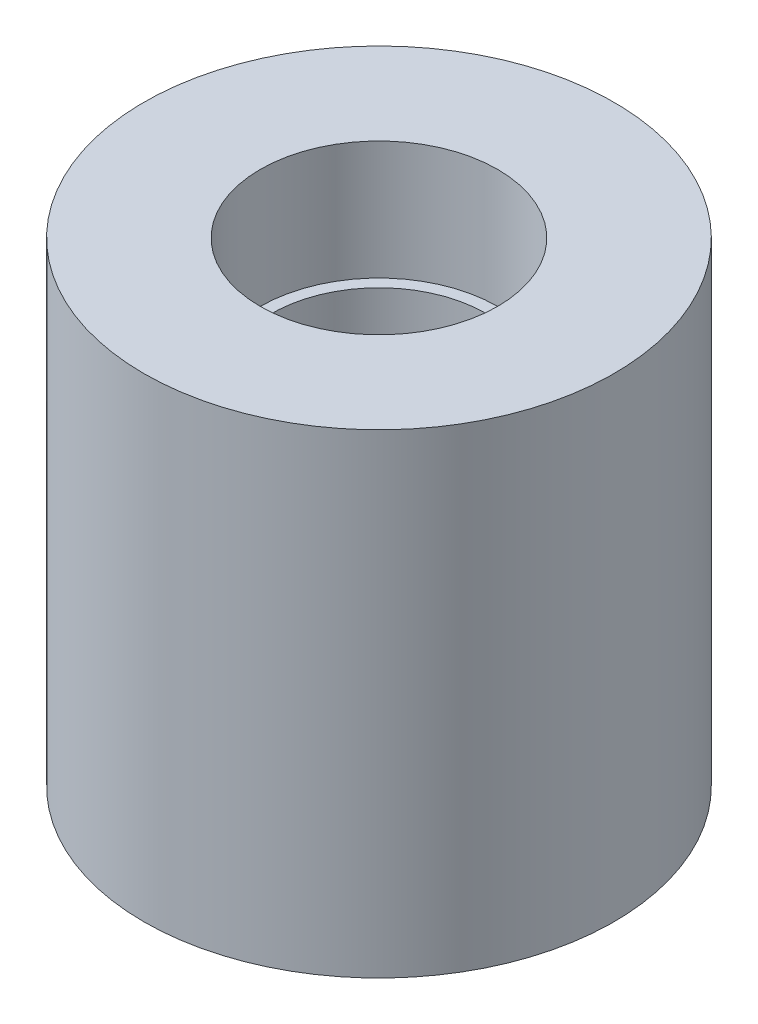
ISO-10303-21;
HEADER;
FILE_DESCRIPTION(('STEP AP214'),'2;1');
FILE_NAME('part.step','',(''),(''),'','','');
FILE_SCHEMA(('AUTOMOTIVE_DESIGN { 1 0 10303 214 1 1 1 1 }'));
ENDSEC;
DATA;
#1=APPLICATION_CONTEXT('core data for automotive mechanical design processes');
#2=APPLICATION_PROTOCOL_DEFINITION('international standard','automotive_design',2000,#1);
#3=PRODUCT_CONTEXT('',#1,'mechanical');
#4=PRODUCT('Part','Part','',(#3));
#5=PRODUCT_RELATED_PRODUCT_CATEGORY('part','',(#4));
#6=PRODUCT_DEFINITION_FORMATION('','',#4);
#7=PRODUCT_DEFINITION_CONTEXT('part definition',#1,'design');
#8=PRODUCT_DEFINITION('design','',#6,#7);
#9=PRODUCT_DEFINITION_SHAPE('','',#8);
#10=(LENGTH_UNIT() NAMED_UNIT(*) SI_UNIT(.MILLI.,.METRE.));
#11=(NAMED_UNIT(*) PLANE_ANGLE_UNIT() SI_UNIT($,.RADIAN.));
#12=(NAMED_UNIT(*) SI_UNIT($,.STERADIAN.) SOLID_ANGLE_UNIT());
#13=UNCERTAINTY_MEASURE_WITH_UNIT(LENGTH_MEASURE(1.E-05),#10,'distance_accuracy_value','');
#14=(GEOMETRIC_REPRESENTATION_CONTEXT(3) GLOBAL_UNCERTAINTY_ASSIGNED_CONTEXT((#13)) GLOBAL_UNIT_ASSIGNED_CONTEXT((#10,
#11,#12)) REPRESENTATION_CONTEXT('',''));
#15=CARTESIAN_POINT('',(0.,0.,0.));
#16=DIRECTION('',(0.,0.,1.));
#17=DIRECTION('',(1.,0.,0.));
#18=AXIS2_PLACEMENT_3D('',#15,#16,#17);
#19=CARTESIAN_POINT('',(0.,25.4,0.));
#20=DIRECTION('',(0.,-1.,0.));
#21=DIRECTION('',(0.,0.,-1.));
#22=AXIS2_PLACEMENT_3D('',#19,#20,#21);
#23=CYLINDRICAL_SURFACE('',#22,5.715);
#24=CARTESIAN_POINT('',(0.,19.05,0.));
#25=DIRECTION('',(0.,1.,0.));
#26=DIRECTION('',(0.,0.,1.));
#27=AXIS2_PLACEMENT_3D('',#24,#25,#26);
#28=CIRCLE('',#27,5.715);
#29=CARTESIAN_POINT('',(0.,19.05,5.715));
#30=VERTEX_POINT('',#29);
#31=EDGE_CURVE('E60',#30,#30,#28,.T.);
#32=ORIENTED_EDGE('',*,*,#31,.T.);
#33=EDGE_LOOP('',(#32));
#34=FACE_BOUND('',#33,.T.);
#35=CARTESIAN_POINT('',(0.,6.35,0.));
#36=DIRECTION('',(0.,-1.,0.));
#37=DIRECTION('',(0.,0.,-1.));
#38=AXIS2_PLACEMENT_3D('',#35,#36,#37);
#39=CIRCLE('',#38,5.715);
#40=CARTESIAN_POINT('',(0.,6.35,-5.715));
#41=VERTEX_POINT('',#40);
#42=EDGE_CURVE('E72',#41,#41,#39,.T.);
#43=ORIENTED_EDGE('',*,*,#42,.T.);
#44=EDGE_LOOP('',(#43));
#45=FACE_BOUND('',#44,.T.);
#46=ADVANCED_FACE('F41',(#34,#45),#23,.F.);
#47=CARTESIAN_POINT('',(0.,25.4,0.));
#48=DIRECTION('',(0.,1.,0.));
#49=DIRECTION('',(0.,0.,1.));
#50=AXIS2_PLACEMENT_3D('',#47,#48,#49);
#51=PLANE('',#50);
#52=CARTESIAN_POINT('',(0.,25.4,0.));
#53=DIRECTION('',(0.,1.,0.));
#54=DIRECTION('',(0.,0.,1.));
#55=AXIS2_PLACEMENT_3D('',#52,#53,#54);
#56=CIRCLE('',#55,6.35);
#57=CARTESIAN_POINT('',(0.,25.4,6.35));
#58=VERTEX_POINT('',#57);
#59=EDGE_CURVE('E56',#58,#58,#56,.T.);
#60=ORIENTED_EDGE('',*,*,#59,.F.);
#61=EDGE_LOOP('',(#60));
#62=FACE_BOUND('',#61,.T.);
#63=CARTESIAN_POINT('',(0.,25.4,0.));
#64=DIRECTION('',(0.,1.,0.));
#65=DIRECTION('',(0.,0.,1.));
#66=AXIS2_PLACEMENT_3D('',#63,#64,#65);
#67=CIRCLE('',#66,12.573);
#68=CARTESIAN_POINT('',(0.,25.4,12.573));
#69=VERTEX_POINT('',#68);
#70=EDGE_CURVE('E10',#69,#69,#67,.T.);
#71=ORIENTED_EDGE('',*,*,#70,.T.);
#72=EDGE_LOOP('',(#71));
#73=FACE_BOUND('',#72,.T.);
#74=ADVANCED_FACE('F97',(#62,#73),#51,.T.);
#75=CARTESIAN_POINT('',(0.,0.,0.));
#76=DIRECTION('',(0.,1.,0.));
#77=DIRECTION('',(0.,0.,1.));
#78=AXIS2_PLACEMENT_3D('',#75,#76,#77);
#79=PLANE('',#78);
#80=CARTESIAN_POINT('',(0.,0.,0.));
#81=DIRECTION('',(0.,-1.,0.));
#82=DIRECTION('',(0.,0.,-1.));
#83=AXIS2_PLACEMENT_3D('',#80,#81,#82);
#84=CIRCLE('',#83,6.35);
#85=CARTESIAN_POINT('',(0.,0.,-6.35));
#86=VERTEX_POINT('',#85);
#87=EDGE_CURVE('E68',#86,#86,#84,.T.);
#88=ORIENTED_EDGE('',*,*,#87,.F.);
#89=EDGE_LOOP('',(#88));
#90=FACE_BOUND('',#89,.T.);
#91=CARTESIAN_POINT('',(0.,0.,0.));
#92=DIRECTION('',(0.,1.,0.));
#93=DIRECTION('',(0.,0.,1.));
#94=AXIS2_PLACEMENT_3D('',#91,#92,#93);
#95=CIRCLE('',#94,12.573);
#96=CARTESIAN_POINT('',(0.,0.,12.573));
#97=VERTEX_POINT('',#96);
#98=EDGE_CURVE('E45',#97,#97,#95,.T.);
#99=ORIENTED_EDGE('',*,*,#98,.F.);
#100=EDGE_LOOP('',(#99));
#101=FACE_BOUND('',#100,.T.);
#102=ADVANCED_FACE('F94',(#90,#101),#79,.F.);
#103=CARTESIAN_POINT('',(0.,25.4,0.));
#104=DIRECTION('',(0.,-1.,0.));
#105=DIRECTION('',(0.,0.,-1.));
#106=AXIS2_PLACEMENT_3D('',#103,#104,#105);
#107=CYLINDRICAL_SURFACE('',#106,12.573);
#108=ORIENTED_EDGE('',*,*,#70,.F.);
#109=EDGE_LOOP('',(#108));
#110=FACE_BOUND('',#109,.T.);
#111=ORIENTED_EDGE('',*,*,#98,.T.);
#112=EDGE_LOOP('',(#111));
#113=FACE_BOUND('',#112,.T.);
#114=ADVANCED_FACE('F43',(#110,#113),#107,.T.);
#115=CARTESIAN_POINT('',(0.,19.05,0.));
#116=DIRECTION('',(0.,1.,0.));
#117=DIRECTION('',(0.,0.,1.));
#118=AXIS2_PLACEMENT_3D('',#115,#116,#117);
#119=CYLINDRICAL_SURFACE('',#118,6.35);
#120=CARTESIAN_POINT('',(0.,19.05,0.));
#121=DIRECTION('',(0.,1.,0.));
#122=DIRECTION('',(0.,0.,1.));
#123=AXIS2_PLACEMENT_3D('',#120,#121,#122);
#124=CIRCLE('',#123,6.35);
#125=CARTESIAN_POINT('',(0.,19.05,6.35));
#126=VERTEX_POINT('',#125);
#127=EDGE_CURVE('E54',#126,#126,#124,.T.);
#128=ORIENTED_EDGE('',*,*,#127,.F.);
#129=EDGE_LOOP('',(#128));
#130=FACE_BOUND('',#129,.T.);
#131=ORIENTED_EDGE('',*,*,#59,.T.);
#132=EDGE_LOOP('',(#131));
#133=FACE_BOUND('',#132,.T.);
#134=ADVANCED_FACE('F101',(#130,#133),#119,.F.);
#135=CARTESIAN_POINT('',(0.,19.05,0.));
#136=DIRECTION('',(0.,1.,0.));
#137=DIRECTION('',(0.,0.,1.));
#138=AXIS2_PLACEMENT_3D('',#135,#136,#137);
#139=PLANE('',#138);
#140=ORIENTED_EDGE('',*,*,#31,.F.);
#141=EDGE_LOOP('',(#140));
#142=FACE_BOUND('',#141,.T.);
#143=ORIENTED_EDGE('',*,*,#127,.T.);
#144=EDGE_LOOP('',(#143));
#145=FACE_BOUND('',#144,.T.);
#146=ADVANCED_FACE('F90',(#142,#145),#139,.T.);
#147=CARTESIAN_POINT('',(0.,6.35,0.));
#148=DIRECTION('',(0.,-1.,0.));
#149=DIRECTION('',(0.,0.,-1.));
#150=AXIS2_PLACEMENT_3D('',#147,#148,#149);
#151=CYLINDRICAL_SURFACE('',#150,6.35);
#152=CARTESIAN_POINT('',(0.,6.35,0.));
#153=DIRECTION('',(0.,-1.,0.));
#154=DIRECTION('',(0.,0.,-1.));
#155=AXIS2_PLACEMENT_3D('',#152,#153,#154);
#156=CIRCLE('',#155,6.35);
#157=CARTESIAN_POINT('',(0.,6.35,-6.35));
#158=VERTEX_POINT('',#157);
#159=EDGE_CURVE('E67',#158,#158,#156,.T.);
#160=ORIENTED_EDGE('',*,*,#159,.F.);
#161=EDGE_LOOP('',(#160));
#162=FACE_BOUND('',#161,.T.);
#163=ORIENTED_EDGE('',*,*,#87,.T.);
#164=EDGE_LOOP('',(#163));
#165=FACE_BOUND('',#164,.T.);
#166=ADVANCED_FACE('F84',(#162,#165),#151,.F.);
#167=CARTESIAN_POINT('',(0.,6.35,0.));
#168=DIRECTION('',(0.,-1.,0.));
#169=DIRECTION('',(0.,0.,-1.));
#170=AXIS2_PLACEMENT_3D('',#167,#168,#169);
#171=PLANE('',#170);
#172=ORIENTED_EDGE('',*,*,#42,.F.);
#173=EDGE_LOOP('',(#172));
#174=FACE_BOUND('',#173,.T.);
#175=ORIENTED_EDGE('',*,*,#159,.T.);
#176=EDGE_LOOP('',(#175));
#177=FACE_BOUND('',#176,.T.);
#178=ADVANCED_FACE('F81',(#174,#177),#171,.T.);
#179=CLOSED_SHELL('',(#46,#74,#102,#114,#134,#146,#166,#178));
#180=MANIFOLD_SOLID_BREP('B2',#179);
#181=ADVANCED_BREP_SHAPE_REPRESENTATION('',(#18,#180),#14);
#182=SHAPE_DEFINITION_REPRESENTATION(#9,#181);
ENDSEC;
END-ISO-10303-21;
